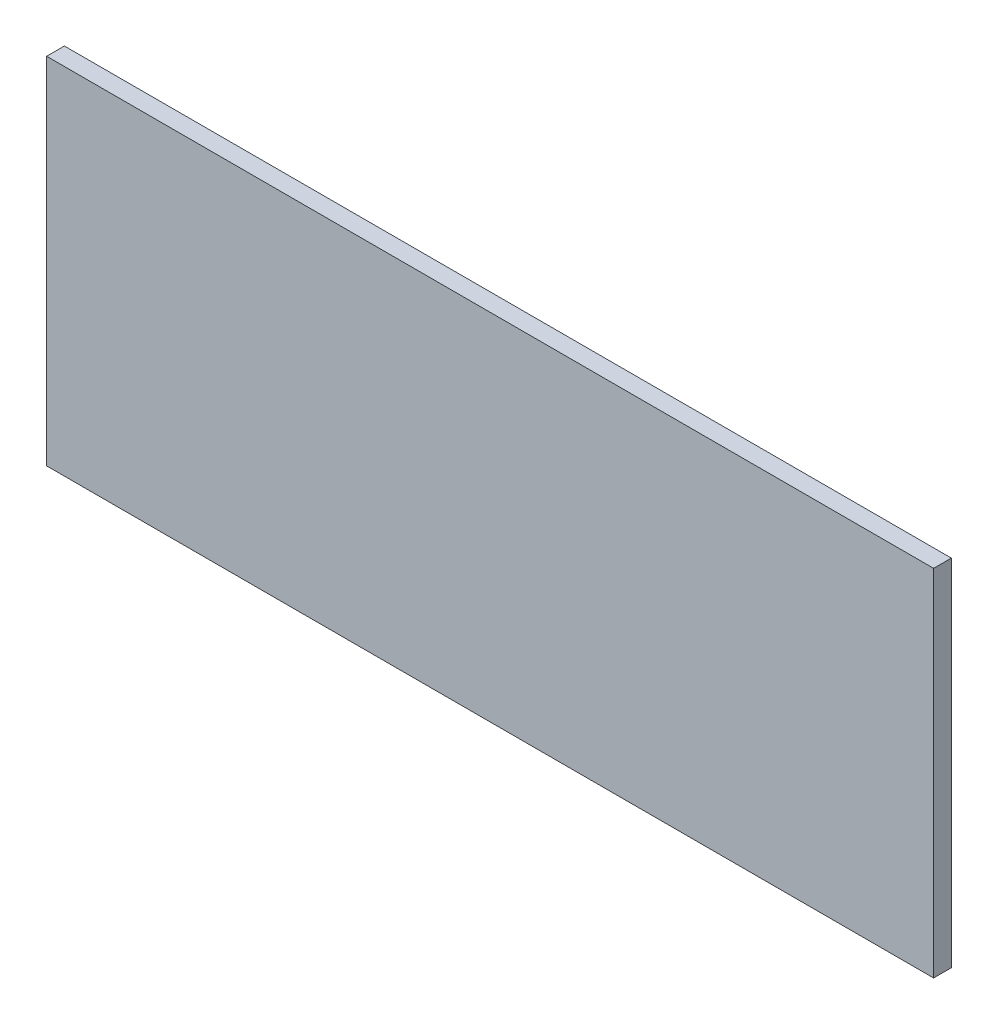
ISO-10303-21;
HEADER;
FILE_DESCRIPTION(('STEP AP214'),'2;1');
FILE_NAME('part.step','',(''),(''),'','','');
FILE_SCHEMA(('AUTOMOTIVE_DESIGN { 1 0 10303 214 1 1 1 1 }'));
ENDSEC;
DATA;
#1=APPLICATION_CONTEXT('core data for automotive mechanical design processes');
#2=APPLICATION_PROTOCOL_DEFINITION('international standard','automotive_design',2000,#1);
#3=PRODUCT_CONTEXT('',#1,'mechanical');
#4=PRODUCT('Part','Part','',(#3));
#5=PRODUCT_RELATED_PRODUCT_CATEGORY('part','',(#4));
#6=PRODUCT_DEFINITION_FORMATION('','',#4);
#7=PRODUCT_DEFINITION_CONTEXT('part definition',#1,'design');
#8=PRODUCT_DEFINITION('design','',#6,#7);
#9=PRODUCT_DEFINITION_SHAPE('','',#8);
#10=(LENGTH_UNIT() NAMED_UNIT(*) SI_UNIT(.MILLI.,.METRE.));
#11=(NAMED_UNIT(*) PLANE_ANGLE_UNIT() SI_UNIT($,.RADIAN.));
#12=(NAMED_UNIT(*) SI_UNIT($,.STERADIAN.) SOLID_ANGLE_UNIT());
#13=UNCERTAINTY_MEASURE_WITH_UNIT(LENGTH_MEASURE(1.E-05),#10,'distance_accuracy_value','');
#14=(GEOMETRIC_REPRESENTATION_CONTEXT(3) GLOBAL_UNCERTAINTY_ASSIGNED_CONTEXT((#13)) GLOBAL_UNIT_ASSIGNED_CONTEXT((#10,
#11,#12)) REPRESENTATION_CONTEXT('',''));
#15=CARTESIAN_POINT('',(0.,0.,0.));
#16=DIRECTION('',(0.,0.,1.));
#17=DIRECTION('',(1.,0.,0.));
#18=AXIS2_PLACEMENT_3D('',#15,#16,#17);
#19=CARTESIAN_POINT('',(-125.,50.,5.));
#20=DIRECTION('',(1.,0.,0.));
#21=DIRECTION('',(0.,0.,-1.));
#22=AXIS2_PLACEMENT_3D('',#19,#20,#21);
#23=PLANE('',#22);
#24=DIRECTION('',(0.,-1.,0.));
#25=VECTOR('',#24,1.);
#26=CARTESIAN_POINT('',(-125.,50.,0.));
#27=LINE('',#26,#25);
#28=CARTESIAN_POINT('',(-125.,50.,0.));
#29=VERTEX_POINT('',#28);
#30=CARTESIAN_POINT('',(-125.,-50.,0.));
#31=VERTEX_POINT('',#30);
#32=EDGE_CURVE('E96',#29,#31,#27,.T.);
#33=ORIENTED_EDGE('',*,*,#32,.T.);
#34=DIRECTION('',(0.,0.,-1.));
#35=VECTOR('',#34,1.);
#36=CARTESIAN_POINT('',(-125.,-50.,5.));
#37=LINE('',#36,#35);
#38=CARTESIAN_POINT('',(-125.,-50.,5.));
#39=VERTEX_POINT('',#38);
#40=EDGE_CURVE('E11',#39,#31,#37,.T.);
#41=ORIENTED_EDGE('',*,*,#40,.F.);
#42=DIRECTION('',(0.,-1.,0.));
#43=VECTOR('',#42,1.);
#44=CARTESIAN_POINT('',(-125.,50.,5.));
#45=LINE('',#44,#43);
#46=CARTESIAN_POINT('',(-125.,50.,5.));
#47=VERTEX_POINT('',#46);
#48=EDGE_CURVE('E84',#47,#39,#45,.T.);
#49=ORIENTED_EDGE('',*,*,#48,.F.);
#50=DIRECTION('',(0.,0.,-1.));
#51=VECTOR('',#50,1.);
#52=CARTESIAN_POINT('',(-125.,50.,5.));
#53=LINE('',#52,#51);
#54=EDGE_CURVE('E92',#47,#29,#53,.T.);
#55=ORIENTED_EDGE('',*,*,#54,.T.);
#56=EDGE_LOOP('',(#33,#41,#49,#55));
#57=FACE_BOUND('',#56,.T.);
#58=ADVANCED_FACE('F33',(#57),#23,.F.);
#59=CARTESIAN_POINT('',(-125.,-50.,5.));
#60=DIRECTION('',(0.,1.,0.));
#61=DIRECTION('',(0.,0.,1.));
#62=AXIS2_PLACEMENT_3D('',#59,#60,#61);
#63=PLANE('',#62);
#64=DIRECTION('',(1.,0.,0.));
#65=VECTOR('',#64,1.);
#66=CARTESIAN_POINT('',(-125.,-50.,0.));
#67=LINE('',#66,#65);
#68=CARTESIAN_POINT('',(125.,-50.,0.));
#69=VERTEX_POINT('',#68);
#70=EDGE_CURVE('E88',#31,#69,#67,.T.);
#71=ORIENTED_EDGE('',*,*,#70,.T.);
#72=DIRECTION('',(0.,0.,-1.));
#73=VECTOR('',#72,1.);
#74=CARTESIAN_POINT('',(125.,-50.,5.));
#75=LINE('',#74,#73);
#76=CARTESIAN_POINT('',(125.,-50.,5.));
#77=VERTEX_POINT('',#76);
#78=EDGE_CURVE('E41',#77,#69,#75,.T.);
#79=ORIENTED_EDGE('',*,*,#78,.F.);
#80=DIRECTION('',(1.,0.,0.));
#81=VECTOR('',#80,1.);
#82=CARTESIAN_POINT('',(-125.,-50.,5.));
#83=LINE('',#82,#81);
#84=EDGE_CURVE('E79',#39,#77,#83,.T.);
#85=ORIENTED_EDGE('',*,*,#84,.F.);
#86=ORIENTED_EDGE('',*,*,#40,.T.);
#87=EDGE_LOOP('',(#71,#79,#85,#86));
#88=FACE_BOUND('',#87,.T.);
#89=ADVANCED_FACE('F87',(#88),#63,.F.);
#90=CARTESIAN_POINT('',(125.,50.,5.));
#91=DIRECTION('',(-1.,0.,0.));
#92=DIRECTION('',(0.,0.,1.));
#93=AXIS2_PLACEMENT_3D('',#90,#91,#92);
#94=PLANE('',#93);
#95=DIRECTION('',(0.,1.,0.));
#96=VECTOR('',#95,1.);
#97=CARTESIAN_POINT('',(125.,50.,0.));
#98=LINE('',#97,#96);
#99=CARTESIAN_POINT('',(125.,50.,0.));
#100=VERTEX_POINT('',#99);
#101=EDGE_CURVE('E66',#69,#100,#98,.T.);
#102=ORIENTED_EDGE('',*,*,#101,.T.);
#103=DIRECTION('',(0.,0.,-1.));
#104=VECTOR('',#103,1.);
#105=CARTESIAN_POINT('',(125.,50.,5.));
#106=LINE('',#105,#104);
#107=CARTESIAN_POINT('',(125.,50.,5.));
#108=VERTEX_POINT('',#107);
#109=EDGE_CURVE('E89',#108,#100,#106,.T.);
#110=ORIENTED_EDGE('',*,*,#109,.F.);
#111=DIRECTION('',(0.,1.,0.));
#112=VECTOR('',#111,1.);
#113=CARTESIAN_POINT('',(125.,50.,5.));
#114=LINE('',#113,#112);
#115=EDGE_CURVE('E82',#77,#108,#114,.T.);
#116=ORIENTED_EDGE('',*,*,#115,.F.);
#117=ORIENTED_EDGE('',*,*,#78,.T.);
#118=EDGE_LOOP('',(#102,#110,#116,#117));
#119=FACE_BOUND('',#118,.T.);
#120=ADVANCED_FACE('F90',(#119),#94,.F.);
#121=CARTESIAN_POINT('',(-125.,50.,5.));
#122=DIRECTION('',(0.,-1.,0.));
#123=DIRECTION('',(0.,0.,-1.));
#124=AXIS2_PLACEMENT_3D('',#121,#122,#123);
#125=PLANE('',#124);
#126=DIRECTION('',(-1.,0.,0.));
#127=VECTOR('',#126,1.);
#128=CARTESIAN_POINT('',(-125.,50.,0.));
#129=LINE('',#128,#127);
#130=EDGE_CURVE('E72',#100,#29,#129,.T.);
#131=ORIENTED_EDGE('',*,*,#130,.T.);
#132=ORIENTED_EDGE('',*,*,#54,.F.);
#133=DIRECTION('',(-1.,0.,0.));
#134=VECTOR('',#133,1.);
#135=CARTESIAN_POINT('',(-125.,50.,5.));
#136=LINE('',#135,#134);
#137=EDGE_CURVE('E49',#108,#47,#136,.T.);
#138=ORIENTED_EDGE('',*,*,#137,.F.);
#139=ORIENTED_EDGE('',*,*,#109,.T.);
#140=EDGE_LOOP('',(#131,#132,#138,#139));
#141=FACE_BOUND('',#140,.T.);
#142=ADVANCED_FACE('F103',(#141),#125,.F.);
#143=CARTESIAN_POINT('',(0.,0.,5.));
#144=DIRECTION('',(0.,0.,1.));
#145=DIRECTION('',(1.,0.,0.));
#146=AXIS2_PLACEMENT_3D('',#143,#144,#145);
#147=PLANE('',#146);
#148=ORIENTED_EDGE('',*,*,#48,.T.);
#149=ORIENTED_EDGE('',*,*,#84,.T.);
#150=ORIENTED_EDGE('',*,*,#115,.T.);
#151=ORIENTED_EDGE('',*,*,#137,.T.);
#152=EDGE_LOOP('',(#148,#149,#150,#151));
#153=FACE_BOUND('',#152,.T.);
#154=ADVANCED_FACE('F80',(#153),#147,.T.);
#155=CARTESIAN_POINT('',(0.,0.,0.));
#156=DIRECTION('',(0.,0.,1.));
#157=DIRECTION('',(1.,0.,0.));
#158=AXIS2_PLACEMENT_3D('',#155,#156,#157);
#159=PLANE('',#158);
#160=ORIENTED_EDGE('',*,*,#32,.F.);
#161=ORIENTED_EDGE('',*,*,#130,.F.);
#162=ORIENTED_EDGE('',*,*,#101,.F.);
#163=ORIENTED_EDGE('',*,*,#70,.F.);
#164=EDGE_LOOP('',(#160,#161,#162,#163));
#165=FACE_BOUND('',#164,.T.);
#166=ADVANCED_FACE('F106',(#165),#159,.F.);
#167=CLOSED_SHELL('',(#58,#89,#120,#142,#154,#166));
#168=MANIFOLD_SOLID_BREP('B2',#167);
#169=ADVANCED_BREP_SHAPE_REPRESENTATION('',(#18,#168),#14);
#170=SHAPE_DEFINITION_REPRESENTATION(#9,#169);
ENDSEC;
END-ISO-10303-21;
